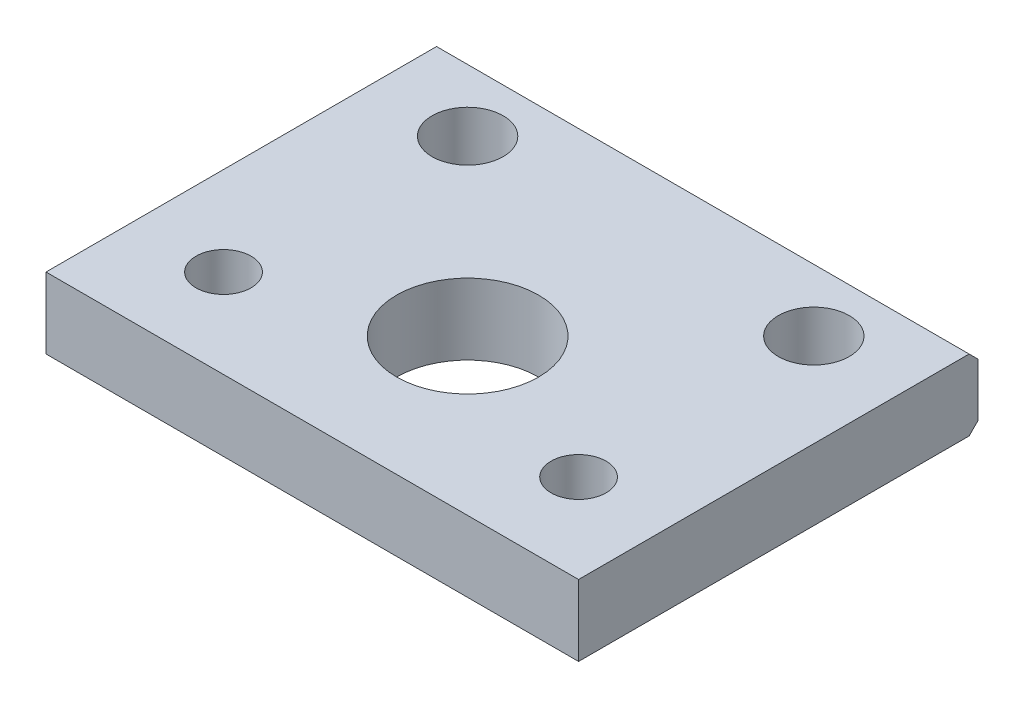
ISO-10303-21;
HEADER;
FILE_DESCRIPTION(('STEP AP214'),'2;1');
FILE_NAME('part.step','',(''),(''),'','','');
FILE_SCHEMA(('AUTOMOTIVE_DESIGN { 1 0 10303 214 1 1 1 1 }'));
ENDSEC;
DATA;
#1=APPLICATION_CONTEXT('core data for automotive mechanical design processes');
#2=APPLICATION_PROTOCOL_DEFINITION('international standard','automotive_design',2000,#1);
#3=PRODUCT_CONTEXT('',#1,'mechanical');
#4=PRODUCT('Part','Part','',(#3));
#5=PRODUCT_RELATED_PRODUCT_CATEGORY('part','',(#4));
#6=PRODUCT_DEFINITION_FORMATION('','',#4);
#7=PRODUCT_DEFINITION_CONTEXT('part definition',#1,'design');
#8=PRODUCT_DEFINITION('design','',#6,#7);
#9=PRODUCT_DEFINITION_SHAPE('','',#8);
#10=(LENGTH_UNIT() NAMED_UNIT(*) SI_UNIT(.MILLI.,.METRE.));
#11=(NAMED_UNIT(*) PLANE_ANGLE_UNIT() SI_UNIT($,.RADIAN.));
#12=(NAMED_UNIT(*) SI_UNIT($,.STERADIAN.) SOLID_ANGLE_UNIT());
#13=UNCERTAINTY_MEASURE_WITH_UNIT(LENGTH_MEASURE(1.E-05),#10,'distance_accuracy_value','');
#14=(GEOMETRIC_REPRESENTATION_CONTEXT(3) GLOBAL_UNCERTAINTY_ASSIGNED_CONTEXT((#13)) GLOBAL_UNIT_ASSIGNED_CONTEXT((#10,
#11,#12)) REPRESENTATION_CONTEXT('',''));
#15=CARTESIAN_POINT('',(0.,0.,0.));
#16=DIRECTION('',(0.,0.,1.));
#17=DIRECTION('',(1.,0.,0.));
#18=AXIS2_PLACEMENT_3D('',#15,#16,#17);
#19=CARTESIAN_POINT('',(0.,0.,0.));
#20=DIRECTION('',(0.,1.,0.));
#21=DIRECTION('',(0.,0.,1.));
#22=AXIS2_PLACEMENT_3D('',#19,#20,#21);
#23=PLANE('',#22);
#24=CARTESIAN_POINT('',(20.,0.,12.5));
#25=DIRECTION('',(0.,-1.,0.));
#26=DIRECTION('',(0.,0.,-1.));
#27=AXIS2_PLACEMENT_3D('',#24,#25,#26);
#28=CIRCLE('',#27,6.6);
#29=CARTESIAN_POINT('',(20.,0.,5.9));
#30=VERTEX_POINT('',#29);
#31=EDGE_CURVE('E313',#30,#30,#28,.T.);
#32=ORIENTED_EDGE('',*,*,#31,.F.);
#33=EDGE_LOOP('',(#32));
#34=FACE_BOUND('',#33,.T.);
#35=CARTESIAN_POINT('',(0.,0.,5.));
#36=DIRECTION('',(0.,1.,0.));
#37=DIRECTION('',(0.,0.,1.));
#38=AXIS2_PLACEMENT_3D('',#35,#36,#37);
#39=CIRCLE('',#38,8.);
#40=CARTESIAN_POINT('',(0.,0.,13.));
#41=VERTEX_POINT('',#40);
#42=EDGE_CURVE('E151',#41,#41,#39,.T.);
#43=ORIENTED_EDGE('',*,*,#42,.T.);
#44=EDGE_LOOP('',(#43));
#45=FACE_BOUND('',#44,.T.);
#46=DIRECTION('',(0.,0.,1.));
#47=VECTOR('',#46,1.);
#48=CARTESIAN_POINT('',(-30.,0.,-22.5));
#49=LINE('',#48,#47);
#50=CARTESIAN_POINT('',(-30.,0.,-21.5));
#51=VERTEX_POINT('',#50);
#52=CARTESIAN_POINT('',(-30.,0.,22.5));
#53=VERTEX_POINT('',#52);
#54=EDGE_CURVE('E117',#51,#53,#49,.T.);
#55=ORIENTED_EDGE('',*,*,#54,.F.);
#56=DIRECTION('',(1.,0.,0.));
#57=VECTOR('',#56,1.);
#58=CARTESIAN_POINT('',(0.,0.,-21.5));
#59=LINE('',#58,#57);
#60=CARTESIAN_POINT('',(30.,0.,-21.5));
#61=VERTEX_POINT('',#60);
#62=EDGE_CURVE('E63',#51,#61,#59,.T.);
#63=ORIENTED_EDGE('',*,*,#62,.T.);
#64=DIRECTION('',(0.,0.,-1.));
#65=VECTOR('',#64,1.);
#66=CARTESIAN_POINT('',(30.,0.,-22.5));
#67=LINE('',#66,#65);
#68=CARTESIAN_POINT('',(30.,0.,22.5));
#69=VERTEX_POINT('',#68);
#70=EDGE_CURVE('E105',#69,#61,#67,.T.);
#71=ORIENTED_EDGE('',*,*,#70,.F.);
#72=DIRECTION('',(1.,0.,0.));
#73=VECTOR('',#72,1.);
#74=CARTESIAN_POINT('',(-30.,0.,22.5));
#75=LINE('',#74,#73);
#76=EDGE_CURVE('E146',#53,#69,#75,.T.);
#77=ORIENTED_EDGE('',*,*,#76,.F.);
#78=EDGE_LOOP('',(#55,#63,#71,#77));
#79=FACE_BOUND('',#78,.T.);
#80=CARTESIAN_POINT('',(-20.,0.,12.5));
#81=DIRECTION('',(0.,-1.,0.));
#82=DIRECTION('',(0.,0.,-1.));
#83=AXIS2_PLACEMENT_3D('',#80,#81,#82);
#84=CIRCLE('',#83,6.6);
#85=CARTESIAN_POINT('',(-20.,0.,5.9));
#86=VERTEX_POINT('',#85);
#87=EDGE_CURVE('E320',#86,#86,#84,.T.);
#88=ORIENTED_EDGE('',*,*,#87,.F.);
#89=EDGE_LOOP('',(#88));
#90=FACE_BOUND('',#89,.T.);
#91=ADVANCED_FACE('F39',(#34,#45,#79,#90),#23,.F.);
#92=CARTESIAN_POINT('',(0.,8.,0.));
#93=DIRECTION('',(0.,1.,0.));
#94=DIRECTION('',(0.,0.,1.));
#95=AXIS2_PLACEMENT_3D('',#92,#93,#94);
#96=PLANE('',#95);
#97=CARTESIAN_POINT('',(20.,8.,12.5));
#98=DIRECTION('',(0.,-1.,0.));
#99=DIRECTION('',(0.,0.,-1.));
#100=AXIS2_PLACEMENT_3D('',#97,#98,#99);
#101=CIRCLE('',#100,3.1);
#102=CARTESIAN_POINT('',(20.,8.,9.4));
#103=VERTEX_POINT('',#102);
#104=EDGE_CURVE('E315',#103,#103,#101,.T.);
#105=ORIENTED_EDGE('',*,*,#104,.T.);
#106=EDGE_LOOP('',(#105));
#107=FACE_BOUND('',#106,.T.);
#108=CARTESIAN_POINT('',(-20.,8.,12.5));
#109=DIRECTION('',(0.,-1.,0.));
#110=DIRECTION('',(0.,0.,-1.));
#111=AXIS2_PLACEMENT_3D('',#108,#109,#110);
#112=CIRCLE('',#111,3.1);
#113=CARTESIAN_POINT('',(-20.,8.,9.4));
#114=VERTEX_POINT('',#113);
#115=EDGE_CURVE('E326',#114,#114,#112,.T.);
#116=ORIENTED_EDGE('',*,*,#115,.T.);
#117=EDGE_LOOP('',(#116));
#118=FACE_BOUND('',#117,.T.);
#119=CARTESIAN_POINT('',(-19.5,8.,-14.5));
#120=DIRECTION('',(0.,1.,0.));
#121=DIRECTION('',(0.,0.,1.));
#122=AXIS2_PLACEMENT_3D('',#119,#120,#121);
#123=CIRCLE('',#122,4.);
#124=CARTESIAN_POINT('',(-19.5,8.,-10.5));
#125=VERTEX_POINT('',#124);
#126=EDGE_CURVE('E333',#125,#125,#123,.T.);
#127=ORIENTED_EDGE('',*,*,#126,.F.);
#128=EDGE_LOOP('',(#127));
#129=FACE_BOUND('',#128,.T.);
#130=CARTESIAN_POINT('',(19.5,8.,-14.5));
#131=DIRECTION('',(0.,1.,0.));
#132=DIRECTION('',(0.,0.,-1.));
#133=AXIS2_PLACEMENT_3D('',#130,#131,#132);
#134=CIRCLE('',#133,4.);
#135=CARTESIAN_POINT('',(19.5,8.,-18.5));
#136=VERTEX_POINT('',#135);
#137=EDGE_CURVE('E329',#136,#136,#134,.T.);
#138=ORIENTED_EDGE('',*,*,#137,.F.);
#139=EDGE_LOOP('',(#138));
#140=FACE_BOUND('',#139,.T.);
#141=DIRECTION('',(0.,0.,-1.));
#142=VECTOR('',#141,1.);
#143=CARTESIAN_POINT('',(30.,8.,-22.5));
#144=LINE('',#143,#142);
#145=CARTESIAN_POINT('',(30.,8.,22.5));
#146=VERTEX_POINT('',#145);
#147=CARTESIAN_POINT('',(30.,8.,-21.5));
#148=VERTEX_POINT('',#147);
#149=EDGE_CURVE('E113',#146,#148,#144,.T.);
#150=ORIENTED_EDGE('',*,*,#149,.T.);
#151=DIRECTION('',(-1.,0.,0.));
#152=VECTOR('',#151,1.);
#153=CARTESIAN_POINT('',(-30.,8.,-21.5));
#154=LINE('',#153,#152);
#155=CARTESIAN_POINT('',(-30.,8.,-21.5));
#156=VERTEX_POINT('',#155);
#157=EDGE_CURVE('E11',#148,#156,#154,.T.);
#158=ORIENTED_EDGE('',*,*,#157,.T.);
#159=DIRECTION('',(0.,0.,1.));
#160=VECTOR('',#159,1.);
#161=CARTESIAN_POINT('',(-30.,8.,-22.5));
#162=LINE('',#161,#160);
#163=CARTESIAN_POINT('',(-30.,8.,22.5));
#164=VERTEX_POINT('',#163);
#165=EDGE_CURVE('E96',#156,#164,#162,.T.);
#166=ORIENTED_EDGE('',*,*,#165,.T.);
#167=DIRECTION('',(1.,0.,0.));
#168=VECTOR('',#167,1.);
#169=CARTESIAN_POINT('',(-30.,8.,22.5));
#170=LINE('',#169,#168);
#171=EDGE_CURVE('E100',#164,#146,#170,.T.);
#172=ORIENTED_EDGE('',*,*,#171,.T.);
#173=EDGE_LOOP('',(#150,#158,#166,#172));
#174=FACE_BOUND('',#173,.T.);
#175=CARTESIAN_POINT('',(0.,8.,5.));
#176=DIRECTION('',(0.,1.,0.));
#177=DIRECTION('',(0.,0.,1.));
#178=AXIS2_PLACEMENT_3D('',#175,#176,#177);
#179=CIRCLE('',#178,8.);
#180=CARTESIAN_POINT('',(0.,8.,13.));
#181=VERTEX_POINT('',#180);
#182=EDGE_CURVE('E147',#181,#181,#179,.T.);
#183=ORIENTED_EDGE('',*,*,#182,.F.);
#184=EDGE_LOOP('',(#183));
#185=FACE_BOUND('',#184,.T.);
#186=ADVANCED_FACE('F98',(#107,#118,#129,#140,#174,#185),#96,.T.);
#187=CARTESIAN_POINT('',(-30.,8.,-22.5));
#188=DIRECTION('',(1.,0.,0.));
#189=DIRECTION('',(0.,0.,-1.));
#190=AXIS2_PLACEMENT_3D('',#187,#188,#189);
#191=PLANE('',#190);
#192=DIRECTION('',(0.,-1.,0.));
#193=VECTOR('',#192,1.);
#194=CARTESIAN_POINT('',(-30.,8.,-22.5));
#195=LINE('',#194,#193);
#196=CARTESIAN_POINT('',(-30.,7.00000000000001,-22.5));
#197=VERTEX_POINT('',#196);
#198=CARTESIAN_POINT('',(-30.,1.,-22.5));
#199=VERTEX_POINT('',#198);
#200=EDGE_CURVE('E143',#197,#199,#195,.T.);
#201=ORIENTED_EDGE('',*,*,#200,.T.);
#202=DIRECTION('',(0.,0.707106781186545,-0.70710678118655));
#203=VECTOR('',#202,1.);
#204=CARTESIAN_POINT('',(-30.,1.,-22.5));
#205=LINE('',#204,#203);
#206=EDGE_CURVE('E131',#199,#51,#205,.F.);
#207=ORIENTED_EDGE('',*,*,#206,.T.);
#208=ORIENTED_EDGE('',*,*,#54,.T.);
#209=DIRECTION('',(0.,-1.,0.));
#210=VECTOR('',#209,1.);
#211=CARTESIAN_POINT('',(-30.,8.,22.5));
#212=LINE('',#211,#210);
#213=EDGE_CURVE('E110',#164,#53,#212,.T.);
#214=ORIENTED_EDGE('',*,*,#213,.F.);
#215=ORIENTED_EDGE('',*,*,#165,.F.);
#216=DIRECTION('',(0.,-0.707106781186548,-0.707106781186548));
#217=VECTOR('',#216,1.);
#218=CARTESIAN_POINT('',(-30.,8.,-21.5));
#219=LINE('',#218,#217);
#220=EDGE_CURVE('E129',#156,#197,#219,.T.);
#221=ORIENTED_EDGE('',*,*,#220,.T.);
#222=EDGE_LOOP('',(#201,#207,#208,#214,#215,#221));
#223=FACE_BOUND('',#222,.T.);
#224=ADVANCED_FACE('F116',(#223),#191,.F.);
#225=CARTESIAN_POINT('',(-30.,8.,22.5));
#226=DIRECTION('',(0.,0.,-1.));
#227=DIRECTION('',(-1.,0.,0.));
#228=AXIS2_PLACEMENT_3D('',#225,#226,#227);
#229=PLANE('',#228);
#230=ORIENTED_EDGE('',*,*,#76,.T.);
#231=DIRECTION('',(0.,-1.,0.));
#232=VECTOR('',#231,1.);
#233=CARTESIAN_POINT('',(30.,8.,22.5));
#234=LINE('',#233,#232);
#235=EDGE_CURVE('E112',#146,#69,#234,.T.);
#236=ORIENTED_EDGE('',*,*,#235,.F.);
#237=ORIENTED_EDGE('',*,*,#171,.F.);
#238=ORIENTED_EDGE('',*,*,#213,.T.);
#239=EDGE_LOOP('',(#230,#236,#237,#238));
#240=FACE_BOUND('',#239,.T.);
#241=ADVANCED_FACE('F109',(#240),#229,.F.);
#242=CARTESIAN_POINT('',(30.,8.,-22.5));
#243=DIRECTION('',(-1.,0.,0.));
#244=DIRECTION('',(0.,0.,1.));
#245=AXIS2_PLACEMENT_3D('',#242,#243,#244);
#246=PLANE('',#245);
#247=ORIENTED_EDGE('',*,*,#70,.T.);
#248=DIRECTION('',(0.,-0.707106781186545,0.70710678118655));
#249=VECTOR('',#248,1.);
#250=CARTESIAN_POINT('',(30.,1.,-22.5));
#251=LINE('',#250,#249);
#252=CARTESIAN_POINT('',(30.,1.,-22.5));
#253=VERTEX_POINT('',#252);
#254=EDGE_CURVE('E48',#61,#253,#251,.F.);
#255=ORIENTED_EDGE('',*,*,#254,.T.);
#256=DIRECTION('',(0.,-1.,0.));
#257=VECTOR('',#256,1.);
#258=CARTESIAN_POINT('',(30.,8.,-22.5));
#259=LINE('',#258,#257);
#260=CARTESIAN_POINT('',(30.,7.00000000000001,-22.5));
#261=VERTEX_POINT('',#260);
#262=EDGE_CURVE('E123',#261,#253,#259,.T.);
#263=ORIENTED_EDGE('',*,*,#262,.F.);
#264=DIRECTION('',(0.,0.707106781186548,0.707106781186548));
#265=VECTOR('',#264,1.);
#266=CARTESIAN_POINT('',(30.,8.,-21.5));
#267=LINE('',#266,#265);
#268=EDGE_CURVE('E55',#261,#148,#267,.T.);
#269=ORIENTED_EDGE('',*,*,#268,.T.);
#270=ORIENTED_EDGE('',*,*,#149,.F.);
#271=ORIENTED_EDGE('',*,*,#235,.T.);
#272=EDGE_LOOP('',(#247,#255,#263,#269,#270,#271));
#273=FACE_BOUND('',#272,.T.);
#274=ADVANCED_FACE('F136',(#273),#246,.F.);
#275=CARTESIAN_POINT('',(-30.,8.,-22.5));
#276=DIRECTION('',(0.,0.,1.));
#277=DIRECTION('',(1.,0.,0.));
#278=AXIS2_PLACEMENT_3D('',#275,#276,#277);
#279=PLANE('',#278);
#280=ORIENTED_EDGE('',*,*,#262,.T.);
#281=DIRECTION('',(-1.,0.,0.));
#282=VECTOR('',#281,1.);
#283=CARTESIAN_POINT('',(-30.,1.,-22.5));
#284=LINE('',#283,#282);
#285=EDGE_CURVE('E121',#253,#199,#284,.T.);
#286=ORIENTED_EDGE('',*,*,#285,.T.);
#287=ORIENTED_EDGE('',*,*,#200,.F.);
#288=DIRECTION('',(1.,0.,0.));
#289=VECTOR('',#288,1.);
#290=CARTESIAN_POINT('',(30.,7.00000000000001,-22.5));
#291=LINE('',#290,#289);
#292=EDGE_CURVE('E119',#197,#261,#291,.T.);
#293=ORIENTED_EDGE('',*,*,#292,.T.);
#294=EDGE_LOOP('',(#280,#286,#287,#293));
#295=FACE_BOUND('',#294,.T.);
#296=ADVANCED_FACE('F140',(#295),#279,.F.);
#297=CARTESIAN_POINT('',(0.,8.,5.));
#298=DIRECTION('',(0.,-1.,0.));
#299=DIRECTION('',(0.,0.,-1.));
#300=AXIS2_PLACEMENT_3D('',#297,#298,#299);
#301=CYLINDRICAL_SURFACE('',#300,8.);
#302=ORIENTED_EDGE('',*,*,#182,.T.);
#303=EDGE_LOOP('',(#302));
#304=FACE_BOUND('',#303,.T.);
#305=ORIENTED_EDGE('',*,*,#42,.F.);
#306=EDGE_LOOP('',(#305));
#307=FACE_BOUND('',#306,.T.);
#308=ADVANCED_FACE('F166',(#304,#307),#301,.F.);
#309=CARTESIAN_POINT('',(-30.,1.,-22.5));
#310=DIRECTION('',(0.,0.70710678118655,0.707106781186545));
#311=DIRECTION('',(-1.,0.,0.));
#312=AXIS2_PLACEMENT_3D('',#309,#310,#311);
#313=PLANE('',#312);
#314=ORIENTED_EDGE('',*,*,#254,.F.);
#315=ORIENTED_EDGE('',*,*,#62,.F.);
#316=ORIENTED_EDGE('',*,*,#206,.F.);
#317=ORIENTED_EDGE('',*,*,#285,.F.);
#318=EDGE_LOOP('',(#314,#315,#316,#317));
#319=FACE_BOUND('',#318,.T.);
#320=ADVANCED_FACE('F144',(#319),#313,.F.);
#321=CARTESIAN_POINT('',(0.,8.,-21.5));
#322=DIRECTION('',(0.,0.707106781186547,-0.707106781186547));
#323=DIRECTION('',(1.,0.,0.));
#324=AXIS2_PLACEMENT_3D('',#321,#322,#323);
#325=PLANE('',#324);
#326=ORIENTED_EDGE('',*,*,#268,.F.);
#327=ORIENTED_EDGE('',*,*,#292,.F.);
#328=ORIENTED_EDGE('',*,*,#220,.F.);
#329=ORIENTED_EDGE('',*,*,#157,.F.);
#330=EDGE_LOOP('',(#326,#327,#328,#329));
#331=FACE_BOUND('',#330,.T.);
#332=ADVANCED_FACE('F42',(#331),#325,.T.);
#333=CARTESIAN_POINT('',(19.5,2.,-14.5));
#334=DIRECTION('',(0.,1.,0.));
#335=DIRECTION('',(0.,0.,1.));
#336=AXIS2_PLACEMENT_3D('',#333,#334,#335);
#337=CYLINDRICAL_SURFACE('',#336,4.);
#338=CARTESIAN_POINT('',(19.5,2.,-14.5));
#339=DIRECTION('',(0.,1.,0.));
#340=DIRECTION('',(0.,0.,-1.));
#341=AXIS2_PLACEMENT_3D('',#338,#339,#340);
#342=CIRCLE('',#341,4.);
#343=CARTESIAN_POINT('',(19.5,2.,-18.5));
#344=VERTEX_POINT('',#343);
#345=EDGE_CURVE('E336',#344,#344,#342,.T.);
#346=ORIENTED_EDGE('',*,*,#345,.F.);
#347=EDGE_LOOP('',(#346));
#348=FACE_BOUND('',#347,.T.);
#349=ORIENTED_EDGE('',*,*,#137,.T.);
#350=EDGE_LOOP('',(#349));
#351=FACE_BOUND('',#350,.T.);
#352=ADVANCED_FACE('F158',(#348,#351),#337,.F.);
#353=CARTESIAN_POINT('',(19.5,2.,-14.5));
#354=DIRECTION('',(0.,-1.,0.));
#355=DIRECTION('',(0.,0.,-1.));
#356=AXIS2_PLACEMENT_3D('',#353,#354,#355);
#357=PLANE('',#356);
#358=ORIENTED_EDGE('',*,*,#345,.T.);
#359=EDGE_LOOP('',(#358));
#360=FACE_BOUND('',#359,.T.);
#361=ADVANCED_FACE('F163',(#360),#357,.F.);
#362=CARTESIAN_POINT('',(-19.5,2.,-14.5));
#363=DIRECTION('',(0.,1.,0.));
#364=DIRECTION('',(0.,0.,1.));
#365=AXIS2_PLACEMENT_3D('',#362,#363,#364);
#366=CYLINDRICAL_SURFACE('',#365,4.);
#367=CARTESIAN_POINT('',(-19.5,2.,-14.5));
#368=DIRECTION('',(0.,1.,0.));
#369=DIRECTION('',(0.,0.,1.));
#370=AXIS2_PLACEMENT_3D('',#367,#368,#369);
#371=CIRCLE('',#370,4.);
#372=CARTESIAN_POINT('',(-19.5,2.,-10.5));
#373=VERTEX_POINT('',#372);
#374=EDGE_CURVE('E330',#373,#373,#371,.T.);
#375=ORIENTED_EDGE('',*,*,#374,.F.);
#376=EDGE_LOOP('',(#375));
#377=FACE_BOUND('',#376,.T.);
#378=ORIENTED_EDGE('',*,*,#126,.T.);
#379=EDGE_LOOP('',(#378));
#380=FACE_BOUND('',#379,.T.);
#381=ADVANCED_FACE('F236',(#377,#380),#366,.F.);
#382=CARTESIAN_POINT('',(-19.5,2.,-14.5));
#383=DIRECTION('',(0.,1.,0.));
#384=DIRECTION('',(0.,0.,1.));
#385=AXIS2_PLACEMENT_3D('',#382,#383,#384);
#386=PLANE('',#385);
#387=ORIENTED_EDGE('',*,*,#374,.T.);
#388=EDGE_LOOP('',(#387));
#389=FACE_BOUND('',#388,.T.);
#390=ADVANCED_FACE('F246',(#389),#386,.T.);
#391=CARTESIAN_POINT('',(-20.,0.,12.5));
#392=DIRECTION('',(0.,-1.,0.));
#393=DIRECTION('',(0.,0.,-1.));
#394=AXIS2_PLACEMENT_3D('',#391,#392,#393);
#395=CYLINDRICAL_SURFACE('',#394,3.1);
#396=ORIENTED_EDGE('',*,*,#115,.F.);
#397=EDGE_LOOP('',(#396));
#398=FACE_BOUND('',#397,.T.);
#399=CARTESIAN_POINT('',(-20.,3.5,12.5));
#400=DIRECTION('',(0.,-1.,0.));
#401=DIRECTION('',(0.,0.,-1.));
#402=AXIS2_PLACEMENT_3D('',#399,#400,#401);
#403=CIRCLE('',#402,3.1);
#404=CARTESIAN_POINT('',(-20.,3.5,9.4));
#405=VERTEX_POINT('',#404);
#406=EDGE_CURVE('E323',#405,#405,#403,.T.);
#407=ORIENTED_EDGE('',*,*,#406,.T.);
#408=EDGE_LOOP('',(#407));
#409=FACE_BOUND('',#408,.T.);
#410=ADVANCED_FACE('F255',(#398,#409),#395,.F.);
#411=CARTESIAN_POINT('',(-20.,0.,12.5));
#412=DIRECTION('',(0.,-1.,0.));
#413=DIRECTION('',(0.,0.,-1.));
#414=AXIS2_PLACEMENT_3D('',#411,#412,#413);
#415=CONICAL_SURFACE('',#414,6.6,0.785398163397449);
#416=ORIENTED_EDGE('',*,*,#406,.F.);
#417=EDGE_LOOP('',(#416));
#418=FACE_BOUND('',#417,.T.);
#419=ORIENTED_EDGE('',*,*,#87,.T.);
#420=EDGE_LOOP('',(#419));
#421=FACE_BOUND('',#420,.T.);
#422=ADVANCED_FACE('F274',(#418,#421),#415,.F.);
#423=CARTESIAN_POINT('',(20.,0.,12.5));
#424=DIRECTION('',(0.,-1.,0.));
#425=DIRECTION('',(0.,0.,-1.));
#426=AXIS2_PLACEMENT_3D('',#423,#424,#425);
#427=CYLINDRICAL_SURFACE('',#426,3.1);
#428=ORIENTED_EDGE('',*,*,#104,.F.);
#429=EDGE_LOOP('',(#428));
#430=FACE_BOUND('',#429,.T.);
#431=CARTESIAN_POINT('',(20.,3.5,12.5));
#432=DIRECTION('',(0.,-1.,0.));
#433=DIRECTION('',(0.,0.,-1.));
#434=AXIS2_PLACEMENT_3D('',#431,#432,#433);
#435=CIRCLE('',#434,3.1);
#436=CARTESIAN_POINT('',(20.,3.5,9.4));
#437=VERTEX_POINT('',#436);
#438=EDGE_CURVE('E311',#437,#437,#435,.T.);
#439=ORIENTED_EDGE('',*,*,#438,.T.);
#440=EDGE_LOOP('',(#439));
#441=FACE_BOUND('',#440,.T.);
#442=ADVANCED_FACE('F284',(#430,#441),#427,.F.);
#443=CARTESIAN_POINT('',(20.,0.,12.5));
#444=DIRECTION('',(0.,-1.,0.));
#445=DIRECTION('',(0.,0.,-1.));
#446=AXIS2_PLACEMENT_3D('',#443,#444,#445);
#447=CONICAL_SURFACE('',#446,6.6,0.785398163397449);
#448=ORIENTED_EDGE('',*,*,#438,.F.);
#449=EDGE_LOOP('',(#448));
#450=FACE_BOUND('',#449,.T.);
#451=ORIENTED_EDGE('',*,*,#31,.T.);
#452=EDGE_LOOP('',(#451));
#453=FACE_BOUND('',#452,.T.);
#454=ADVANCED_FACE('F294',(#450,#453),#447,.F.);
#455=CLOSED_SHELL('',(#91,#186,#224,#241,#274,#296,#308,#320,#332,#352,#361,#381,#390,#410,#422,
#442,#454));
#456=MANIFOLD_SOLID_BREP('B2',#455);
#457=ADVANCED_BREP_SHAPE_REPRESENTATION('',(#18,#456),#14);
#458=SHAPE_DEFINITION_REPRESENTATION(#9,#457);
ENDSEC;
END-ISO-10303-21;
